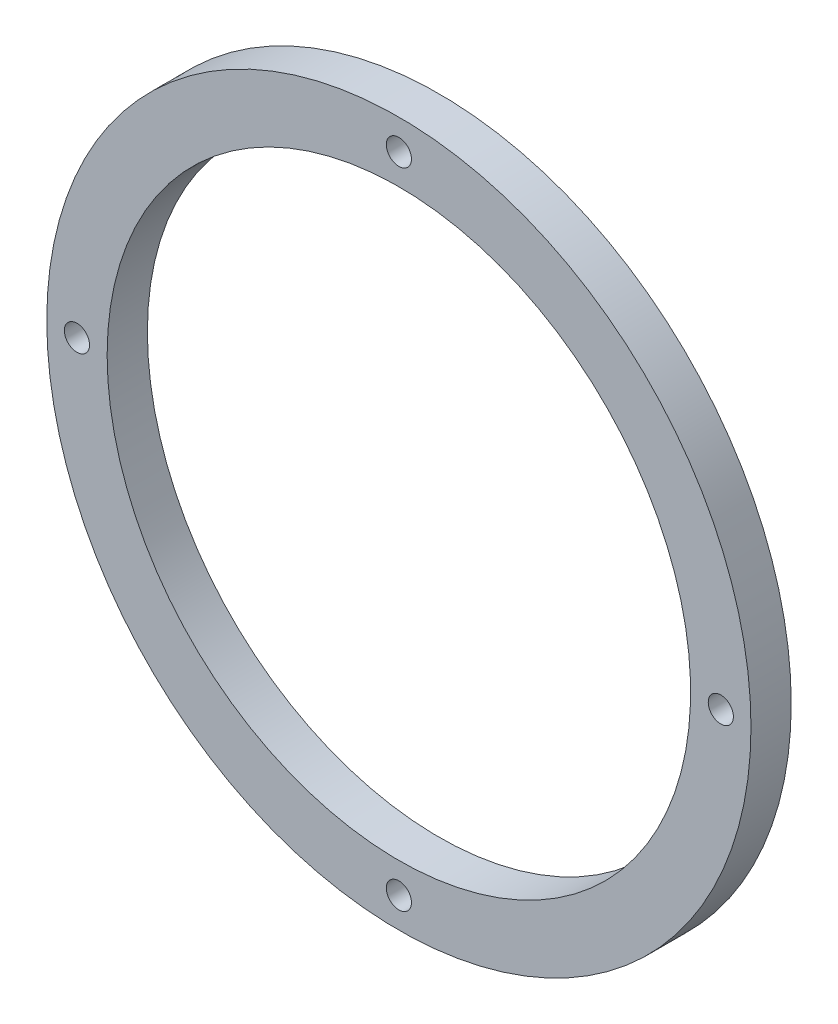
ISO-10303-21;
HEADER;
FILE_DESCRIPTION(('STEP AP214'),'2;1');
FILE_NAME('part.step','',(''),(''),'','','');
FILE_SCHEMA(('AUTOMOTIVE_DESIGN { 1 0 10303 214 1 1 1 1 }'));
ENDSEC;
DATA;
#1=APPLICATION_CONTEXT('core data for automotive mechanical design processes');
#2=APPLICATION_PROTOCOL_DEFINITION('international standard','automotive_design',2000,#1);
#3=PRODUCT_CONTEXT('',#1,'mechanical');
#4=PRODUCT('Part','Part','',(#3));
#5=PRODUCT_RELATED_PRODUCT_CATEGORY('part','',(#4));
#6=PRODUCT_DEFINITION_FORMATION('','',#4);
#7=PRODUCT_DEFINITION_CONTEXT('part definition',#1,'design');
#8=PRODUCT_DEFINITION('design','',#6,#7);
#9=PRODUCT_DEFINITION_SHAPE('','',#8);
#10=(LENGTH_UNIT() NAMED_UNIT(*) SI_UNIT(.MILLI.,.METRE.));
#11=(NAMED_UNIT(*) PLANE_ANGLE_UNIT() SI_UNIT($,.RADIAN.));
#12=(NAMED_UNIT(*) SI_UNIT($,.STERADIAN.) SOLID_ANGLE_UNIT());
#13=UNCERTAINTY_MEASURE_WITH_UNIT(LENGTH_MEASURE(1.E-05),#10,'distance_accuracy_value','');
#14=(GEOMETRIC_REPRESENTATION_CONTEXT(3) GLOBAL_UNCERTAINTY_ASSIGNED_CONTEXT((#13)) GLOBAL_UNIT_ASSIGNED_CONTEXT((#10,
#11,#12)) REPRESENTATION_CONTEXT('',''));
#15=CARTESIAN_POINT('',(0.,0.,0.));
#16=DIRECTION('',(0.,0.,1.));
#17=DIRECTION('',(1.,0.,0.));
#18=AXIS2_PLACEMENT_3D('',#15,#16,#17);
#19=CARTESIAN_POINT('',(-41.0121933088198,41.0121933088197,3.6721288561821));
#20=DIRECTION('',(0.707106781186548,-0.707106781186547,0.));
#21=DIRECTION('',(0.707106781186547,0.707106781186548,0.));
#22=AXIS2_PLACEMENT_3D('',#19,#20,#21);
#23=PLANE('',#22);
#24=CARTESIAN_POINT('',(-41.0121933088198,41.0121933088197,3.6721288561821));
#25=DIRECTION('',(0.707106781186548,-0.707106781186547,0.));
#26=DIRECTION('',(0.707106781186547,0.707106781186548,0.));
#27=AXIS2_PLACEMENT_3D('',#24,#25,#26);
#28=CIRCLE('',#27,2.117);
#29=CARTESIAN_POINT('',(-39.5152482530479,42.5091383645916,3.6721288561821));
#30=VERTEX_POINT('',#29);
#31=EDGE_CURVE('E40',#30,#30,#28,.T.);
#32=ORIENTED_EDGE('',*,*,#31,.F.);
#33=EDGE_LOOP('',(#32));
#34=FACE_BOUND('',#33,.T.);
#35=ADVANCED_FACE('F17',(#34),#23,.F.);
#36=CARTESIAN_POINT('',(-45.2548339959391,45.254833995939,3.6721288561821));
#37=DIRECTION('',(0.707106781186548,-0.707106781186547,0.));
#38=DIRECTION('',(0.707106781186547,0.707106781186548,0.));
#39=AXIS2_PLACEMENT_3D('',#36,#37,#38);
#40=CYLINDRICAL_SURFACE('',#39,2.117);
#41=ORIENTED_EDGE('',*,*,#31,.T.);
#42=EDGE_LOOP('',(#41));
#43=FACE_BOUND('',#42,.T.);
#44=CARTESIAN_POINT('',(-47.9778885818736,50.9717785370035,3.67144454196515));
#45=CARTESIAN_POINT('',(-47.9778646135178,50.9718014720483,3.79032814136771));
#46=CARTESIAN_POINT('',(-47.9851539677852,50.9649429642961,3.90930049785056));
#47=CARTESIAN_POINT('',(-48.0141690647131,50.9376084139676,4.14397315607816));
#48=CARTESIAN_POINT('',(-48.0359120495528,50.9171161071895,4.2596693775496));
#49=CARTESIAN_POINT('',(-48.0931605473308,50.8630460152564,4.48435602862354));
#50=CARTESIAN_POINT('',(-48.1286593250604,50.8294746339272,4.59334970975665));
#51=CARTESIAN_POINT('',(-48.2123208505564,50.7501273480217,4.80156077301868));
#52=CARTESIAN_POINT('',(-48.2604805078424,50.7043544217657,4.90078053281681));
#53=CARTESIAN_POINT('',(-48.368022139905,50.6017780482986,5.08670354598485));
#54=CARTESIAN_POINT('',(-48.4274084874604,50.544970302804,5.17340189899738));
#55=CARTESIAN_POINT('',(-48.5556011199169,50.4218353687035,5.33177980165759));
#56=CARTESIAN_POINT('',(-48.6244077798792,50.3555078010696,5.4034587530339));
#57=CARTESIAN_POINT('',(-48.7693964907318,50.2150986885646,5.52977093344561));
#58=CARTESIAN_POINT('',(-48.8455798190266,50.1410158005376,5.58440120324972));
#59=CARTESIAN_POINT('',(-49.0030611053252,49.9871194525476,5.67504600678073));
#60=CARTESIAN_POINT('',(-49.08435904267,49.9073060157313,5.71106061569497));
#61=CARTESIAN_POINT('',(-49.2496727666906,49.7441776065482,5.76344120103706));
#62=CARTESIAN_POINT('',(-49.3336877093032,49.6608637192681,5.77981322053332));
#63=CARTESIAN_POINT('',(-49.5020432066102,49.4930484290544,5.792462508783));
#64=CARTESIAN_POINT('',(-49.5863837599921,49.4085470309043,5.78873985845442));
#65=CARTESIAN_POINT('',(-49.7529742302093,49.2407913049074,5.76131057820729));
#66=CARTESIAN_POINT('',(-49.8352248220895,49.1575365780555,5.73761048762162));
#67=CARTESIAN_POINT('',(-49.9953725336815,48.994650517249,5.67090921171893));
#68=CARTESIAN_POINT('',(-50.0732696437622,48.9150191913106,5.62790798370385));
#69=CARTESIAN_POINT('',(-50.2225868629702,48.7616984418374,5.52381762489213));
#70=CARTESIAN_POINT('',(-50.2940059006481,48.6880100014567,5.46272550902919));
#71=CARTESIAN_POINT('',(-50.4284240435411,48.5487737079255,5.324189776038));
#72=CARTESIAN_POINT('',(-50.4914231291388,48.4832258737416,5.24674612081376));
#73=CARTESIAN_POINT('',(-50.6073468415707,48.3622113467307,5.07766867803317));
#74=CARTESIAN_POINT('',(-50.6602674223023,48.3067487030926,4.98602921810868));
#75=CARTESIAN_POINT('',(-50.7546084550489,48.2076178481923,4.79118146802407));
#76=CARTESIAN_POINT('',(-50.7960289051208,48.1639496389229,4.68797317590926));
#77=CARTESIAN_POINT('',(-50.866288335326,48.0897425152124,4.47291420093321));
#78=CARTESIAN_POINT('',(-50.8951271802744,48.0592037418424,4.36106342522677));
#79=CARTESIAN_POINT('',(-50.9394739576165,48.0121968470265,4.13189603949864));
#80=CARTESIAN_POINT('',(-50.9549819269296,47.9957286866127,4.01457944461527));
#81=CARTESIAN_POINT('',(-50.9722624491282,47.9773761600087,3.77786041175373));
#82=CARTESIAN_POINT('',(-50.9740404398942,47.9754860200639,3.65845881833921));
#83=CARTESIAN_POINT('',(-50.9638294435508,47.9863328645726,3.42091546717143));
#84=CARTESIAN_POINT('',(-50.9518404727095,47.9990698317417,3.30277370792961));
#85=CARTESIAN_POINT('',(-50.9144088277288,48.0387729879711,3.07112584984493));
#86=CARTESIAN_POINT('',(-50.888968637287,48.0657365501629,2.95761889937535));
#87=CARTESIAN_POINT('',(-50.825295001196,48.1330605966798,2.73843655301037));
#88=CARTESIAN_POINT('',(-50.7870615293922,48.1734211083937,2.63276117312635));
#89=CARTESIAN_POINT('',(-50.6987829266182,48.2663184964033,2.43220522027784));
#90=CARTESIAN_POINT('',(-50.6487340795424,48.3188592034519,2.33732805745067));
#91=CARTESIAN_POINT('',(-50.5381456739456,48.4345147209997,2.16109602802115));
#92=CARTESIAN_POINT('',(-50.477606088256,48.4976295588834,2.07974119643963));
#93=CARTESIAN_POINT('',(-50.3476225613719,48.632557652613,1.93283670137371));
#94=CARTESIAN_POINT('',(-50.2781757476048,48.7043737141798,1.86729215642236));
#95=CARTESIAN_POINT('',(-50.132263201968,48.8545507876771,1.75390382166526));
#96=CARTESIAN_POINT('',(-50.0557974860221,48.9329117847589,1.70605999170303));
#97=CARTESIAN_POINT('',(-49.8979512258834,49.0938606727757,1.62944015029332));
#98=CARTESIAN_POINT('',(-49.816571536001,49.1764478286005,1.60066083477276));
#99=CARTESIAN_POINT('',(-49.6511454682147,49.343465254846,1.56297612656804));
#100=CARTESIAN_POINT('',(-49.567099092764,49.427895523571,1.55407071560057));
#101=CARTESIAN_POINT('',(-49.3987454182629,49.5961501432324,1.55638701153029));
#102=CARTESIAN_POINT('',(-49.3144382372184,49.6799747233372,1.567600657409));
#103=CARTESIAN_POINT('',(-49.1479429798017,49.844692998162,1.60982016215504));
#104=CARTESIAN_POINT('',(-49.0657549076155,49.9255866870926,1.64082606011542));
#105=CARTESIAN_POINT('',(-48.9058832943929,50.082203549544,1.72174878617985));
#106=CARTESIAN_POINT('',(-48.8281998259927,50.157926639693,1.77166591912768));
#107=CARTESIAN_POINT('',(-48.6796264855476,50.3021341208158,1.88899139699482));
#108=CARTESIAN_POINT('',(-48.608736368275,50.3706187730932,1.95639911021013));
#109=CARTESIAN_POINT('',(-48.4758367061867,50.4985324623565,2.10681607372764));
#110=CARTESIAN_POINT('',(-48.4138297769751,50.5579588325111,2.1898299025931));
#111=CARTESIAN_POINT('',(-48.3005735268138,50.6661696823972,2.36911898311867));
#112=CARTESIAN_POINT('',(-48.2493268733087,50.7149515234944,2.46539751329086));
#113=CARTESIAN_POINT('',(-48.1591407690749,50.8006008163619,2.66852109371218));
#114=CARTESIAN_POINT('',(-48.1202093614416,50.8374604821034,2.7753729898845));
#115=CARTESIAN_POINT('',(-48.0559292470862,50.8982282530926,2.99647979646473));
#116=CARTESIAN_POINT('',(-48.0305643450065,50.9221518015327,3.11072569654158));
#117=CARTESIAN_POINT('',(-48.0009241056464,50.9500884531313,3.29998523676825));
#118=CARTESIAN_POINT('',(-47.9923128216416,50.9581982959553,3.37376844030324));
#119=CARTESIAN_POINT('',(-47.9808025862103,50.9690361359254,3.52217094336143));
#120=CARTESIAN_POINT('',(-47.9779036330733,50.9717641346829,3.59679024263431));
#121=CARTESIAN_POINT('',(-47.9778885818736,50.9717785370035,3.67144454196515));
#122=B_SPLINE_CURVE_WITH_KNOTS('',3,(#44,#45,#46,#47,#48,#49,#50,#51,#52,#53,#54,#55,#56,#57,
#58,#59,#60,#61,#62,#63,#64,#65,#66,#67,#68,#69,#70,#71,#72,#73,#74,#75,#76,#77,#78,#79,#80,#81,
#82,#83,#84,#85,#86,#87,#88,#89,#90,#91,#92,#93,#94,#95,#96,#97,#98,#99,#100,#101,#102,#103,
#104,#105,#106,#107,#108,#109,#110,#111,#112,#113,#114,#115,#116,#117,#118,#119,#120,#121),
.UNSPECIFIED.,.T.,.F.,(4,2,2,2,2,2,2,2,2,2,2,2,2,2,2,2,2,2,2,2,2,2,2,2,2,2,2,2,2,2,2,2,2,2,2,2,
2,2,4),(0.,0.356378313670749,0.713182526723448,1.06981225906443,1.42635501991816,
1.7830369408371,2.13973306685139,2.49649107213745,2.85324763649191,3.20989441605358,
3.56653975945722,3.92306840535988,4.27959783998062,4.63618613614513,4.99277526310171,
5.34950724545013,5.70623928807246,6.06297516355786,6.41971005107364,6.77630364330334,
7.13289681415428,7.48942416491341,7.84595224456066,8.20259260716525,8.55923389340115,
8.91599048668497,9.2727462706128,9.62944020896935,9.98613381917968,10.3426845463648,
10.6992359778001,11.0557931569885,11.4123374602605,11.7689865311455,12.1257239103108,
12.4826937961632,12.8392365836715,13.0630284389227,13.2868202271719),.UNSPECIFIED.);
#123=CARTESIAN_POINT('',(-47.9778885818736,50.9717785370034,3.67144454196515));
#124=VERTEX_POINT('',#123);
#125=EDGE_CURVE('E29',#124,#124,#122,.T.);
#126=ORIENTED_EDGE('',*,*,#125,.F.);
#127=EDGE_LOOP('',(#126));
#128=FACE_BOUND('',#127,.T.);
#129=ADVANCED_FACE('F49',(#43,#128),#40,.F.);
#130=CARTESIAN_POINT('',(0.,0.,8.));
#131=DIRECTION('',(0.,0.,-1.));
#132=DIRECTION('',(-1.,0.,0.));
#133=AXIS2_PLACEMENT_3D('',#130,#131,#132);
#134=CYLINDRICAL_SURFACE('',#133,70.);
#135=CARTESIAN_POINT('',(0.,0.,8.));
#136=DIRECTION('',(0.,0.,-1.));
#137=DIRECTION('',(-1.,0.,0.));
#138=AXIS2_PLACEMENT_3D('',#135,#136,#137);
#139=CIRCLE('',#138,70.);
#140=CARTESIAN_POINT('',(-70.,0.,8.));
#141=VERTEX_POINT('',#140);
#142=EDGE_CURVE('E34',#141,#141,#139,.F.);
#143=ORIENTED_EDGE('',*,*,#142,.F.);
#144=EDGE_LOOP('',(#143));
#145=FACE_BOUND('',#144,.T.);
#146=ORIENTED_EDGE('',*,*,#125,.T.);
#147=EDGE_LOOP('',(#146));
#148=FACE_BOUND('',#147,.T.);
#149=CARTESIAN_POINT('',(0.,0.,0.));
#150=DIRECTION('',(0.,0.,-1.));
#151=DIRECTION('',(-1.,0.,0.));
#152=AXIS2_PLACEMENT_3D('',#149,#150,#151);
#153=CIRCLE('',#152,70.);
#154=CARTESIAN_POINT('',(-70.,0.,0.));
#155=VERTEX_POINT('',#154);
#156=EDGE_CURVE('E33',#155,#155,#153,.F.);
#157=ORIENTED_EDGE('',*,*,#156,.T.);
#158=EDGE_LOOP('',(#157));
#159=FACE_BOUND('',#158,.T.);
#160=ADVANCED_FACE('F30',(#145,#148,#159),#134,.T.);
#161=CARTESIAN_POINT('',(0.,0.,8.));
#162=DIRECTION('',(0.,0.,1.));
#163=DIRECTION('',(1.,0.,0.));
#164=AXIS2_PLACEMENT_3D('',#161,#162,#163);
#165=PLANE('',#164);
#166=CARTESIAN_POINT('',(64.0000009536743,0.,8.));
#167=DIRECTION('',(0.,0.,-1.));
#168=DIRECTION('',(-1.,0.,0.));
#169=AXIS2_PLACEMENT_3D('',#166,#167,#168);
#170=CIRCLE('',#169,2.5);
#171=CARTESIAN_POINT('',(61.5000009536743,0.,8.));
#172=VERTEX_POINT('',#171);
#173=EDGE_CURVE('E37',#172,#172,#170,.T.);
#174=ORIENTED_EDGE('',*,*,#173,.T.);
#175=EDGE_LOOP('',(#174));
#176=FACE_BOUND('',#175,.T.);
#177=CARTESIAN_POINT('',(0.,64.0000009536743,8.));
#178=DIRECTION('',(0.,0.,-1.));
#179=DIRECTION('',(-1.,0.,0.));
#180=AXIS2_PLACEMENT_3D('',#177,#178,#179);
#181=CIRCLE('',#180,2.5);
#182=CARTESIAN_POINT('',(-2.5,64.0000009536743,8.));
#183=VERTEX_POINT('',#182);
#184=EDGE_CURVE('E153',#183,#183,#181,.T.);
#185=ORIENTED_EDGE('',*,*,#184,.T.);
#186=EDGE_LOOP('',(#185));
#187=FACE_BOUND('',#186,.T.);
#188=CARTESIAN_POINT('',(0.,0.,8.));
#189=DIRECTION('',(0.,0.,-1.));
#190=DIRECTION('',(-1.,0.,0.));
#191=AXIS2_PLACEMENT_3D('',#188,#189,#190);
#192=CIRCLE('',#191,58.);
#193=CARTESIAN_POINT('',(-58.,0.,8.));
#194=VERTEX_POINT('',#193);
#195=EDGE_CURVE('E11',#194,#194,#192,.T.);
#196=ORIENTED_EDGE('',*,*,#195,.T.);
#197=EDGE_LOOP('',(#196));
#198=FACE_BOUND('',#197,.T.);
#199=CARTESIAN_POINT('',(-64.0000009536743,0.,8.));
#200=DIRECTION('',(0.,0.,-1.));
#201=DIRECTION('',(-1.,0.,0.));
#202=AXIS2_PLACEMENT_3D('',#199,#200,#201);
#203=CIRCLE('',#202,2.5);
#204=CARTESIAN_POINT('',(-66.5000009536743,0.,8.));
#205=VERTEX_POINT('',#204);
#206=EDGE_CURVE('E150',#205,#205,#203,.T.);
#207=ORIENTED_EDGE('',*,*,#206,.T.);
#208=EDGE_LOOP('',(#207));
#209=FACE_BOUND('',#208,.T.);
#210=CARTESIAN_POINT('',(0.,-64.0000009536743,8.));
#211=DIRECTION('',(0.,0.,-1.));
#212=DIRECTION('',(-1.,0.,0.));
#213=AXIS2_PLACEMENT_3D('',#210,#211,#212);
#214=CIRCLE('',#213,2.5);
#215=CARTESIAN_POINT('',(-2.50000000000001,-64.0000009536743,8.));
#216=VERTEX_POINT('',#215);
#217=EDGE_CURVE('E105',#216,#216,#214,.T.);
#218=ORIENTED_EDGE('',*,*,#217,.T.);
#219=EDGE_LOOP('',(#218));
#220=FACE_BOUND('',#219,.T.);
#221=ORIENTED_EDGE('',*,*,#142,.T.);
#222=EDGE_LOOP('',(#221));
#223=FACE_BOUND('',#222,.T.);
#224=ADVANCED_FACE('F56',(#176,#187,#198,#209,#220,#223),#165,.T.);
#225=CARTESIAN_POINT('',(0.,0.,0.));
#226=DIRECTION('',(0.,0.,1.));
#227=DIRECTION('',(1.,0.,0.));
#228=AXIS2_PLACEMENT_3D('',#225,#226,#227);
#229=PLANE('',#228);
#230=CARTESIAN_POINT('',(0.,0.,0.));
#231=DIRECTION('',(0.,0.,-1.));
#232=DIRECTION('',(-1.,0.,0.));
#233=AXIS2_PLACEMENT_3D('',#230,#231,#232);
#234=CIRCLE('',#233,58.);
#235=CARTESIAN_POINT('',(-58.,0.,0.));
#236=VERTEX_POINT('',#235);
#237=EDGE_CURVE('E24',#236,#236,#234,.T.);
#238=ORIENTED_EDGE('',*,*,#237,.F.);
#239=EDGE_LOOP('',(#238));
#240=FACE_BOUND('',#239,.T.);
#241=CARTESIAN_POINT('',(0.,-64.0000009536743,5.68356126051661E-11));
#242=DIRECTION('',(0.,0.,-1.));
#243=DIRECTION('',(-1.,0.,0.));
#244=AXIS2_PLACEMENT_3D('',#241,#242,#243);
#245=CIRCLE('',#244,4.99999999993861);
#246=CARTESIAN_POINT('',(-4.99999999993862,-64.0000009536743,5.68356126051661E-11));
#247=VERTEX_POINT('',#246);
#248=EDGE_CURVE('E133',#247,#247,#245,.T.);
#249=ORIENTED_EDGE('',*,*,#248,.F.);
#250=EDGE_LOOP('',(#249));
#251=FACE_BOUND('',#250,.T.);
#252=CARTESIAN_POINT('',(64.0000009536743,0.,4.77395900588817E-11));
#253=DIRECTION('',(0.,0.,-1.));
#254=DIRECTION('',(-1.,0.,0.));
#255=AXIS2_PLACEMENT_3D('',#252,#253,#254);
#256=CIRCLE('',#255,4.99999999993861);
#257=CARTESIAN_POINT('',(59.0000009537357,0.,4.77395900588817E-11));
#258=VERTEX_POINT('',#257);
#259=EDGE_CURVE('E137',#258,#258,#256,.F.);
#260=ORIENTED_EDGE('',*,*,#259,.T.);
#261=EDGE_LOOP('',(#260));
#262=FACE_BOUND('',#261,.T.);
#263=CARTESIAN_POINT('',(0.,64.0000009536743,5.6843418860808E-11));
#264=DIRECTION('',(0.,0.,-1.));
#265=DIRECTION('',(-1.,0.,0.));
#266=AXIS2_PLACEMENT_3D('',#263,#264,#265);
#267=CIRCLE('',#266,4.99999999993861);
#268=CARTESIAN_POINT('',(-4.99999999993861,64.0000009536743,5.6843418860808E-11));
#269=VERTEX_POINT('',#268);
#270=EDGE_CURVE('E116',#269,#269,#267,.F.);
#271=ORIENTED_EDGE('',*,*,#270,.T.);
#272=EDGE_LOOP('',(#271));
#273=FACE_BOUND('',#272,.T.);
#274=CARTESIAN_POINT('',(-64.0000009536743,0.,-4.77395900588817E-11));
#275=DIRECTION('',(0.,0.,-1.));
#276=DIRECTION('',(-1.,0.,0.));
#277=AXIS2_PLACEMENT_3D('',#274,#275,#276);
#278=CIRCLE('',#277,4.99999999999545);
#279=CARTESIAN_POINT('',(-69.0000009536698,0.,-4.77395900588817E-11));
#280=VERTEX_POINT('',#279);
#281=EDGE_CURVE('E110',#280,#280,#278,.T.);
#282=ORIENTED_EDGE('',*,*,#281,.F.);
#283=EDGE_LOOP('',(#282));
#284=FACE_BOUND('',#283,.T.);
#285=ORIENTED_EDGE('',*,*,#156,.F.);
#286=EDGE_LOOP('',(#285));
#287=FACE_BOUND('',#286,.T.);
#288=ADVANCED_FACE('F61',(#240,#251,#262,#273,#284,#287),#229,.F.);
#289=CARTESIAN_POINT('',(0.,-64.0000009536743,1.13686837721616E-10));
#290=DIRECTION('',(0.,0.,-1.));
#291=DIRECTION('',(-1.,0.,0.));
#292=AXIS2_PLACEMENT_3D('',#289,#290,#291);
#293=CONICAL_SURFACE('',#292,4.99999999988176,0.785398163397448);
#294=CARTESIAN_POINT('',(0.,-64.0000009536743,2.5));
#295=DIRECTION('',(0.,0.,-1.));
#296=DIRECTION('',(-1.,0.,0.));
#297=AXIS2_PLACEMENT_3D('',#294,#295,#296);
#298=CIRCLE('',#297,2.5);
#299=CARTESIAN_POINT('',(-2.50000000000001,-64.0000009536743,2.5));
#300=VERTEX_POINT('',#299);
#301=EDGE_CURVE('E108',#300,#300,#298,.F.);
#302=ORIENTED_EDGE('',*,*,#301,.T.);
#303=EDGE_LOOP('',(#302));
#304=FACE_BOUND('',#303,.T.);
#305=ORIENTED_EDGE('',*,*,#248,.T.);
#306=EDGE_LOOP('',(#305));
#307=FACE_BOUND('',#306,.T.);
#308=ADVANCED_FACE('F65',(#304,#307),#293,.F.);
#309=CARTESIAN_POINT('',(64.0000009536743,0.,1.13686837721616E-10));
#310=DIRECTION('',(0.,0.,-1.));
#311=DIRECTION('',(-1.,0.,0.));
#312=AXIS2_PLACEMENT_3D('',#309,#310,#311);
#313=CONICAL_SURFACE('',#312,4.99999999987266,0.785398163397448);
#314=CARTESIAN_POINT('',(64.0000009536743,0.,2.5));
#315=DIRECTION('',(0.,0.,-1.));
#316=DIRECTION('',(-1.,0.,0.));
#317=AXIS2_PLACEMENT_3D('',#314,#315,#316);
#318=CIRCLE('',#317,2.5);
#319=CARTESIAN_POINT('',(61.5000009536743,0.,2.5));
#320=VERTEX_POINT('',#319);
#321=EDGE_CURVE('E109',#320,#320,#318,.F.);
#322=ORIENTED_EDGE('',*,*,#321,.T.);
#323=EDGE_LOOP('',(#322));
#324=FACE_BOUND('',#323,.T.);
#325=ORIENTED_EDGE('',*,*,#259,.F.);
#326=EDGE_LOOP('',(#325));
#327=FACE_BOUND('',#326,.T.);
#328=ADVANCED_FACE('F69',(#324,#327),#313,.F.);
#329=CARTESIAN_POINT('',(0.,64.0000009536743,1.13686837721616E-10));
#330=DIRECTION('',(0.,0.,-1.));
#331=DIRECTION('',(-1.,0.,0.));
#332=AXIS2_PLACEMENT_3D('',#329,#330,#331);
#333=CONICAL_SURFACE('',#332,4.99999999988177,0.785398163397448);
#334=CARTESIAN_POINT('',(0.,64.0000009536743,2.5));
#335=DIRECTION('',(0.,0.,-1.));
#336=DIRECTION('',(-1.,0.,0.));
#337=AXIS2_PLACEMENT_3D('',#334,#335,#336);
#338=CIRCLE('',#337,2.5);
#339=CARTESIAN_POINT('',(-2.5,64.0000009536743,2.5));
#340=VERTEX_POINT('',#339);
#341=EDGE_CURVE('E113',#340,#340,#338,.F.);
#342=ORIENTED_EDGE('',*,*,#341,.T.);
#343=EDGE_LOOP('',(#342));
#344=FACE_BOUND('',#343,.T.);
#345=ORIENTED_EDGE('',*,*,#270,.F.);
#346=EDGE_LOOP('',(#345));
#347=FACE_BOUND('',#346,.T.);
#348=ADVANCED_FACE('F73',(#344,#347),#333,.F.);
#349=CARTESIAN_POINT('',(-64.0000009536743,0.,5.6843418860808E-11));
#350=DIRECTION('',(0.,0.,-1.));
#351=DIRECTION('',(-1.,0.,0.));
#352=AXIS2_PLACEMENT_3D('',#349,#350,#351);
#353=CONICAL_SURFACE('',#352,4.99999999989087,0.785398163397448);
#354=CARTESIAN_POINT('',(-64.0000009536743,0.,2.5));
#355=DIRECTION('',(0.,0.,-1.));
#356=DIRECTION('',(-1.,0.,0.));
#357=AXIS2_PLACEMENT_3D('',#354,#355,#356);
#358=CIRCLE('',#357,2.5);
#359=CARTESIAN_POINT('',(-66.5000009536743,0.,2.5));
#360=VERTEX_POINT('',#359);
#361=EDGE_CURVE('E122',#360,#360,#358,.F.);
#362=ORIENTED_EDGE('',*,*,#361,.T.);
#363=EDGE_LOOP('',(#362));
#364=FACE_BOUND('',#363,.T.);
#365=ORIENTED_EDGE('',*,*,#281,.T.);
#366=EDGE_LOOP('',(#365));
#367=FACE_BOUND('',#366,.T.);
#368=ADVANCED_FACE('F77',(#364,#367),#353,.F.);
#369=CARTESIAN_POINT('',(64.0000009536743,0.,8.));
#370=DIRECTION('',(0.,0.,-1.));
#371=DIRECTION('',(-1.,0.,0.));
#372=AXIS2_PLACEMENT_3D('',#369,#370,#371);
#373=CYLINDRICAL_SURFACE('',#372,2.5);
#374=ORIENTED_EDGE('',*,*,#173,.F.);
#375=EDGE_LOOP('',(#374));
#376=FACE_BOUND('',#375,.T.);
#377=ORIENTED_EDGE('',*,*,#321,.F.);
#378=EDGE_LOOP('',(#377));
#379=FACE_BOUND('',#378,.T.);
#380=ADVANCED_FACE('F81',(#376,#379),#373,.F.);
#381=CARTESIAN_POINT('',(0.,64.0000009536743,8.));
#382=DIRECTION('',(0.,0.,-1.));
#383=DIRECTION('',(-1.,0.,0.));
#384=AXIS2_PLACEMENT_3D('',#381,#382,#383);
#385=CYLINDRICAL_SURFACE('',#384,2.5);
#386=ORIENTED_EDGE('',*,*,#184,.F.);
#387=EDGE_LOOP('',(#386));
#388=FACE_BOUND('',#387,.T.);
#389=ORIENTED_EDGE('',*,*,#341,.F.);
#390=EDGE_LOOP('',(#389));
#391=FACE_BOUND('',#390,.T.);
#392=ADVANCED_FACE('F85',(#388,#391),#385,.F.);
#393=CARTESIAN_POINT('',(-64.0000009536743,0.,8.));
#394=DIRECTION('',(0.,0.,-1.));
#395=DIRECTION('',(-1.,0.,0.));
#396=AXIS2_PLACEMENT_3D('',#393,#394,#395);
#397=CYLINDRICAL_SURFACE('',#396,2.5);
#398=ORIENTED_EDGE('',*,*,#206,.F.);
#399=EDGE_LOOP('',(#398));
#400=FACE_BOUND('',#399,.T.);
#401=ORIENTED_EDGE('',*,*,#361,.F.);
#402=EDGE_LOOP('',(#401));
#403=FACE_BOUND('',#402,.T.);
#404=ADVANCED_FACE('F89',(#400,#403),#397,.F.);
#405=CARTESIAN_POINT('',(0.,-64.0000009536743,8.));
#406=DIRECTION('',(0.,0.,-1.));
#407=DIRECTION('',(-1.,0.,0.));
#408=AXIS2_PLACEMENT_3D('',#405,#406,#407);
#409=CYLINDRICAL_SURFACE('',#408,2.5);
#410=ORIENTED_EDGE('',*,*,#217,.F.);
#411=EDGE_LOOP('',(#410));
#412=FACE_BOUND('',#411,.T.);
#413=ORIENTED_EDGE('',*,*,#301,.F.);
#414=EDGE_LOOP('',(#413));
#415=FACE_BOUND('',#414,.T.);
#416=ADVANCED_FACE('F92',(#412,#415),#409,.F.);
#417=CARTESIAN_POINT('',(0.,0.,8.));
#418=DIRECTION('',(0.,0.,-1.));
#419=DIRECTION('',(-1.,0.,0.));
#420=AXIS2_PLACEMENT_3D('',#417,#418,#419);
#421=CYLINDRICAL_SURFACE('',#420,58.);
#422=ORIENTED_EDGE('',*,*,#237,.T.);
#423=EDGE_LOOP('',(#422));
#424=FACE_BOUND('',#423,.T.);
#425=ORIENTED_EDGE('',*,*,#195,.F.);
#426=EDGE_LOOP('',(#425));
#427=FACE_BOUND('',#426,.T.);
#428=ADVANCED_FACE('F58',(#424,#427),#421,.F.);
#429=CLOSED_SHELL('',(#35,#129,#160,#224,#288,#308,#328,#348,#368,#380,#392,#404,#416,#428));
#430=MANIFOLD_SOLID_BREP('B1',#429);
#431=ADVANCED_BREP_SHAPE_REPRESENTATION('',(#18,#430),#14);
#432=SHAPE_DEFINITION_REPRESENTATION(#9,#431);
ENDSEC;
END-ISO-10303-21;
